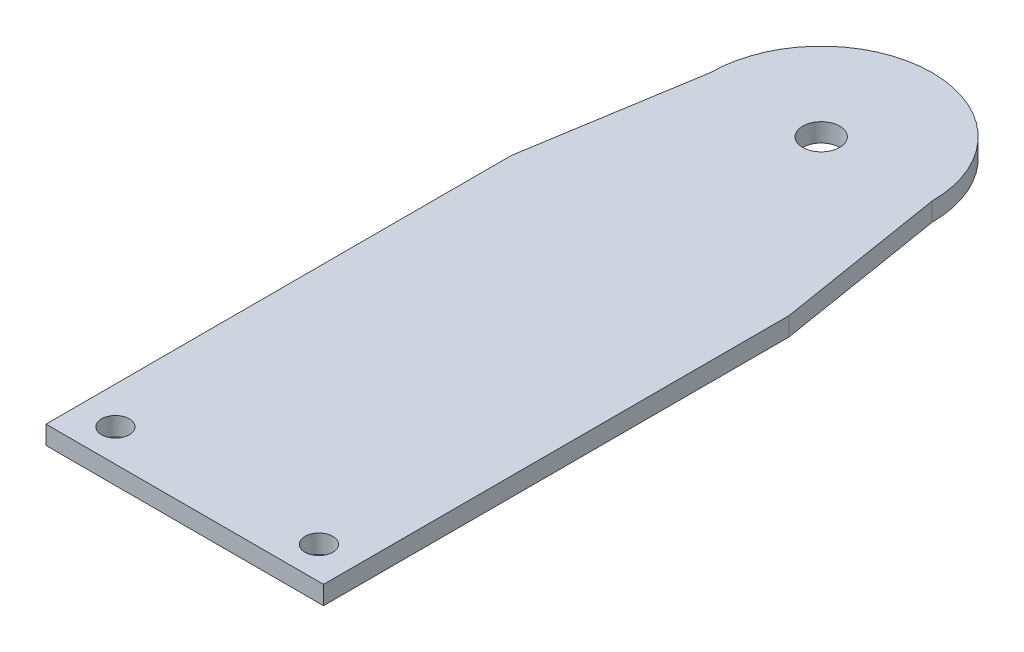
ISO-10303-21;
HEADER;
FILE_DESCRIPTION(('STEP AP214'),'2;1');
FILE_NAME('part.step','',(''),(''),'','','');
FILE_SCHEMA(('AUTOMOTIVE_DESIGN { 1 0 10303 214 1 1 1 1 }'));
ENDSEC;
DATA;
#1=APPLICATION_CONTEXT('core data for automotive mechanical design processes');
#2=APPLICATION_PROTOCOL_DEFINITION('international standard','automotive_design',2000,#1);
#3=PRODUCT_CONTEXT('',#1,'mechanical');
#4=PRODUCT('Part','Part','',(#3));
#5=PRODUCT_RELATED_PRODUCT_CATEGORY('part','',(#4));
#6=PRODUCT_DEFINITION_FORMATION('','',#4);
#7=PRODUCT_DEFINITION_CONTEXT('part definition',#1,'design');
#8=PRODUCT_DEFINITION('design','',#6,#7);
#9=PRODUCT_DEFINITION_SHAPE('','',#8);
#10=(LENGTH_UNIT() NAMED_UNIT(*) SI_UNIT(.MILLI.,.METRE.));
#11=(NAMED_UNIT(*) PLANE_ANGLE_UNIT() SI_UNIT($,.RADIAN.));
#12=(NAMED_UNIT(*) SI_UNIT($,.STERADIAN.) SOLID_ANGLE_UNIT());
#13=UNCERTAINTY_MEASURE_WITH_UNIT(LENGTH_MEASURE(1.E-05),#10,'distance_accuracy_value','');
#14=(GEOMETRIC_REPRESENTATION_CONTEXT(3) GLOBAL_UNCERTAINTY_ASSIGNED_CONTEXT((#13)) GLOBAL_UNIT_ASSIGNED_CONTEXT((#10,
#11,#12)) REPRESENTATION_CONTEXT('',''));
#15=CARTESIAN_POINT('',(0.,0.,0.));
#16=DIRECTION('',(0.,0.,1.));
#17=DIRECTION('',(1.,0.,0.));
#18=AXIS2_PLACEMENT_3D('',#15,#16,#17);
#19=CARTESIAN_POINT('',(-2.62522791540278,2.,-39.1827211912994));
#20=DIRECTION('',(0.,1.,0.));
#21=DIRECTION('',(0.,0.,1.));
#22=AXIS2_PLACEMENT_3D('',#19,#20,#21);
#23=PLANE('',#22);
#24=CARTESIAN_POINT('',(8.37477208459722,2.,26.1172788087006));
#25=DIRECTION('',(0.,1.,0.));
#26=DIRECTION('',(0.,0.,1.));
#27=AXIS2_PLACEMENT_3D('',#24,#25,#26);
#28=CIRCLE('',#27,1.5);
#29=CARTESIAN_POINT('',(8.37477208459722,2.,27.6172788087006));
#30=VERTEX_POINT('',#29);
#31=EDGE_CURVE('E186',#30,#30,#28,.T.);
#32=ORIENTED_EDGE('',*,*,#31,.F.);
#33=EDGE_LOOP('',(#32));
#34=FACE_BOUND('',#33,.T.);
#35=DIRECTION('',(0.,0.,1.));
#36=VECTOR('',#35,1.);
#37=CARTESIAN_POINT('',(-17.6252279154028,2.,29.6172788087006));
#38=LINE('',#37,#36);
#39=CARTESIAN_POINT('',(-17.6252279154028,2.,-20.6827211912994));
#40=VERTEX_POINT('',#39);
#41=CARTESIAN_POINT('',(-17.6252279154028,2.,29.6172788087006));
#42=VERTEX_POINT('',#41);
#43=EDGE_CURVE('E131',#40,#42,#38,.T.);
#44=ORIENTED_EDGE('',*,*,#43,.T.);
#45=DIRECTION('',(1.,0.,0.));
#46=VECTOR('',#45,1.);
#47=CARTESIAN_POINT('',(-10.6252279154028,2.,29.6172788087006));
#48=LINE('',#47,#46);
#49=CARTESIAN_POINT('',(12.3747720845972,2.,29.6172788087006));
#50=VERTEX_POINT('',#49);
#51=EDGE_CURVE('E89',#42,#50,#48,.T.);
#52=ORIENTED_EDGE('',*,*,#51,.T.);
#53=DIRECTION('',(0.,0.,-1.));
#54=VECTOR('',#53,1.);
#55=CARTESIAN_POINT('',(12.3747720845972,2.,29.6172788087006));
#56=LINE('',#55,#54);
#57=CARTESIAN_POINT('',(12.3747720845972,2.,-20.6827211912994));
#58=VERTEX_POINT('',#57);
#59=EDGE_CURVE('E102',#50,#58,#56,.T.);
#60=ORIENTED_EDGE('',*,*,#59,.T.);
#61=DIRECTION('',(-0.160071158553662,0.,-0.987105477747585));
#62=VECTOR('',#61,1.);
#63=CARTESIAN_POINT('',(12.3747720845972,2.,-20.6827211912994));
#64=LINE('',#63,#62);
#65=CARTESIAN_POINT('',(9.37477208459723,2.,-39.1827211912994));
#66=VERTEX_POINT('',#65);
#67=EDGE_CURVE('E96',#58,#66,#64,.T.);
#68=ORIENTED_EDGE('',*,*,#67,.T.);
#69=CARTESIAN_POINT('',(-2.62522791540278,2.,-39.1827211912994));
#70=DIRECTION('',(0.,1.,0.));
#71=DIRECTION('',(0.,0.,1.));
#72=AXIS2_PLACEMENT_3D('',#69,#70,#71);
#73=CIRCLE('',#72,12.);
#74=CARTESIAN_POINT('',(-14.6252279154028,2.,-39.1827211912994));
#75=VERTEX_POINT('',#74);
#76=EDGE_CURVE('E100',#66,#75,#73,.T.);
#77=ORIENTED_EDGE('',*,*,#76,.T.);
#78=DIRECTION('',(-0.160071158553662,0.,0.987105477747585));
#79=VECTOR('',#78,1.);
#80=CARTESIAN_POINT('',(-17.6252279154028,2.,-20.6827211912994));
#81=LINE('',#80,#79);
#82=EDGE_CURVE('E52',#75,#40,#81,.T.);
#83=ORIENTED_EDGE('',*,*,#82,.T.);
#84=EDGE_LOOP('',(#44,#52,#60,#68,#77,#83));
#85=FACE_BOUND('',#84,.T.);
#86=CARTESIAN_POINT('',(-13.6252279154028,2.,26.1172788087006));
#87=DIRECTION('',(0.,1.,0.));
#88=DIRECTION('',(0.,0.,1.));
#89=AXIS2_PLACEMENT_3D('',#86,#87,#88);
#90=CIRCLE('',#89,1.5);
#91=CARTESIAN_POINT('',(-13.6252279154028,2.,27.6172788087006));
#92=VERTEX_POINT('',#91);
#93=EDGE_CURVE('E124',#92,#92,#90,.T.);
#94=ORIENTED_EDGE('',*,*,#93,.F.);
#95=EDGE_LOOP('',(#94));
#96=FACE_BOUND('',#95,.T.);
#97=CARTESIAN_POINT('',(-2.62522791540278,2.,-39.1827211912994));
#98=DIRECTION('',(0.,1.,0.));
#99=DIRECTION('',(0.,0.,1.));
#100=AXIS2_PLACEMENT_3D('',#97,#98,#99);
#101=CIRCLE('',#100,2.);
#102=CARTESIAN_POINT('',(-2.62522791540278,2.,-37.1827211912994));
#103=VERTEX_POINT('',#102);
#104=EDGE_CURVE('E177',#103,#103,#101,.T.);
#105=ORIENTED_EDGE('',*,*,#104,.F.);
#106=EDGE_LOOP('',(#105));
#107=FACE_BOUND('',#106,.T.);
#108=ADVANCED_FACE('F35',(#34,#85,#96,#107),#23,.T.);
#109=CARTESIAN_POINT('',(-2.62522791540278,0.,-39.1827211912994));
#110=DIRECTION('',(0.,1.,0.));
#111=DIRECTION('',(0.,0.,1.));
#112=AXIS2_PLACEMENT_3D('',#109,#110,#111);
#113=PLANE('',#112);
#114=DIRECTION('',(0.,0.,1.));
#115=VECTOR('',#114,1.);
#116=CARTESIAN_POINT('',(-17.6252279154028,0.,29.6172788087006));
#117=LINE('',#116,#115);
#118=CARTESIAN_POINT('',(-17.6252279154028,0.,-20.6827211912994));
#119=VERTEX_POINT('',#118);
#120=CARTESIAN_POINT('',(-17.6252279154028,0.,29.6172788087006));
#121=VERTEX_POINT('',#120);
#122=EDGE_CURVE('E120',#119,#121,#117,.T.);
#123=ORIENTED_EDGE('',*,*,#122,.F.);
#124=DIRECTION('',(-0.160071158553662,0.,0.987105477747585));
#125=VECTOR('',#124,1.);
#126=CARTESIAN_POINT('',(-17.6252279154028,0.,-20.6827211912994));
#127=LINE('',#126,#125);
#128=CARTESIAN_POINT('',(-14.6252279154028,0.,-39.1827211912994));
#129=VERTEX_POINT('',#128);
#130=EDGE_CURVE('E81',#129,#119,#127,.T.);
#131=ORIENTED_EDGE('',*,*,#130,.F.);
#132=CARTESIAN_POINT('',(-2.62522791540278,0.,-39.1827211912994));
#133=DIRECTION('',(0.,1.,0.));
#134=DIRECTION('',(0.,0.,1.));
#135=AXIS2_PLACEMENT_3D('',#132,#133,#134);
#136=CIRCLE('',#135,12.);
#137=CARTESIAN_POINT('',(9.37477208459723,0.,-39.1827211912994));
#138=VERTEX_POINT('',#137);
#139=EDGE_CURVE('E75',#138,#129,#136,.T.);
#140=ORIENTED_EDGE('',*,*,#139,.F.);
#141=DIRECTION('',(-0.160071158553662,0.,-0.987105477747585));
#142=VECTOR('',#141,1.);
#143=CARTESIAN_POINT('',(12.3747720845972,0.,-20.6827211912994));
#144=LINE('',#143,#142);
#145=CARTESIAN_POINT('',(12.3747720845972,0.,-20.6827211912994));
#146=VERTEX_POINT('',#145);
#147=EDGE_CURVE('E110',#146,#138,#144,.T.);
#148=ORIENTED_EDGE('',*,*,#147,.F.);
#149=DIRECTION('',(0.,0.,-1.));
#150=VECTOR('',#149,1.);
#151=CARTESIAN_POINT('',(12.3747720845972,0.,29.6172788087006));
#152=LINE('',#151,#150);
#153=CARTESIAN_POINT('',(12.3747720845972,0.,29.6172788087006));
#154=VERTEX_POINT('',#153);
#155=EDGE_CURVE('E126',#154,#146,#152,.T.);
#156=ORIENTED_EDGE('',*,*,#155,.F.);
#157=DIRECTION('',(1.,0.,0.));
#158=VECTOR('',#157,1.);
#159=CARTESIAN_POINT('',(5.37477208459723,0.,29.6172788087006));
#160=LINE('',#159,#158);
#161=EDGE_CURVE('E123',#121,#154,#160,.T.);
#162=ORIENTED_EDGE('',*,*,#161,.F.);
#163=EDGE_LOOP('',(#123,#131,#140,#148,#156,#162));
#164=FACE_BOUND('',#163,.T.);
#165=CARTESIAN_POINT('',(-13.6252279154028,0.,26.1172788087006));
#166=DIRECTION('',(0.,1.,0.));
#167=DIRECTION('',(0.,0.,1.));
#168=AXIS2_PLACEMENT_3D('',#165,#166,#167);
#169=CIRCLE('',#168,1.5);
#170=CARTESIAN_POINT('',(-13.6252279154028,0.,27.6172788087006));
#171=VERTEX_POINT('',#170);
#172=EDGE_CURVE('E189',#171,#171,#169,.T.);
#173=ORIENTED_EDGE('',*,*,#172,.T.);
#174=EDGE_LOOP('',(#173));
#175=FACE_BOUND('',#174,.T.);
#176=CARTESIAN_POINT('',(8.37477208459722,0.,26.1172788087006));
#177=DIRECTION('',(0.,1.,0.));
#178=DIRECTION('',(0.,0.,1.));
#179=AXIS2_PLACEMENT_3D('',#176,#177,#178);
#180=CIRCLE('',#179,1.5);
#181=CARTESIAN_POINT('',(8.37477208459722,0.,27.6172788087006));
#182=VERTEX_POINT('',#181);
#183=EDGE_CURVE('E183',#182,#182,#180,.T.);
#184=ORIENTED_EDGE('',*,*,#183,.T.);
#185=EDGE_LOOP('',(#184));
#186=FACE_BOUND('',#185,.T.);
#187=CARTESIAN_POINT('',(-2.62522791540278,0.,-39.1827211912994));
#188=DIRECTION('',(0.,1.,0.));
#189=DIRECTION('',(0.,0.,1.));
#190=AXIS2_PLACEMENT_3D('',#187,#188,#189);
#191=CIRCLE('',#190,2.);
#192=CARTESIAN_POINT('',(-2.62522791540278,0.,-37.1827211912994));
#193=VERTEX_POINT('',#192);
#194=EDGE_CURVE('E180',#193,#193,#191,.T.);
#195=ORIENTED_EDGE('',*,*,#194,.T.);
#196=EDGE_LOOP('',(#195));
#197=FACE_BOUND('',#196,.T.);
#198=ADVANCED_FACE('F140',(#164,#175,#186,#197),#113,.F.);
#199=CARTESIAN_POINT('',(-17.6252279154028,2.,29.6172788087006));
#200=DIRECTION('',(1.,0.,0.));
#201=DIRECTION('',(0.,0.,-1.));
#202=AXIS2_PLACEMENT_3D('',#199,#200,#201);
#203=PLANE('',#202);
#204=ORIENTED_EDGE('',*,*,#122,.T.);
#205=DIRECTION('',(0.,-1.,0.));
#206=VECTOR('',#205,1.);
#207=CARTESIAN_POINT('',(-17.6252279154028,2.,29.6172788087006));
#208=LINE('',#207,#206);
#209=EDGE_CURVE('E11',#42,#121,#208,.T.);
#210=ORIENTED_EDGE('',*,*,#209,.F.);
#211=ORIENTED_EDGE('',*,*,#43,.F.);
#212=DIRECTION('',(0.,-1.,0.));
#213=VECTOR('',#212,1.);
#214=CARTESIAN_POINT('',(-17.6252279154028,2.,-20.6827211912994));
#215=LINE('',#214,#213);
#216=EDGE_CURVE('E116',#40,#119,#215,.T.);
#217=ORIENTED_EDGE('',*,*,#216,.T.);
#218=EDGE_LOOP('',(#204,#210,#211,#217));
#219=FACE_BOUND('',#218,.T.);
#220=ADVANCED_FACE('F37',(#219),#203,.F.);
#221=CARTESIAN_POINT('',(5.37477208459723,2.,29.6172788087006));
#222=DIRECTION('',(0.,0.,-1.));
#223=DIRECTION('',(-1.,0.,0.));
#224=AXIS2_PLACEMENT_3D('',#221,#222,#223);
#225=PLANE('',#224);
#226=ORIENTED_EDGE('',*,*,#161,.T.);
#227=DIRECTION('',(0.,-1.,0.));
#228=VECTOR('',#227,1.);
#229=CARTESIAN_POINT('',(12.3747720845972,2.,29.6172788087006));
#230=LINE('',#229,#228);
#231=EDGE_CURVE('E44',#50,#154,#230,.T.);
#232=ORIENTED_EDGE('',*,*,#231,.F.);
#233=ORIENTED_EDGE('',*,*,#51,.F.);
#234=ORIENTED_EDGE('',*,*,#209,.T.);
#235=EDGE_LOOP('',(#226,#232,#233,#234));
#236=FACE_BOUND('',#235,.T.);
#237=ADVANCED_FACE('F239',(#236),#225,.F.);
#238=CARTESIAN_POINT('',(12.3747720845972,2.,29.6172788087006));
#239=DIRECTION('',(-1.,0.,0.));
#240=DIRECTION('',(0.,0.,1.));
#241=AXIS2_PLACEMENT_3D('',#238,#239,#240);
#242=PLANE('',#241);
#243=ORIENTED_EDGE('',*,*,#155,.T.);
#244=DIRECTION('',(0.,-1.,0.));
#245=VECTOR('',#244,1.);
#246=CARTESIAN_POINT('',(12.3747720845972,2.,-20.6827211912994));
#247=LINE('',#246,#245);
#248=EDGE_CURVE('E111',#58,#146,#247,.T.);
#249=ORIENTED_EDGE('',*,*,#248,.F.);
#250=ORIENTED_EDGE('',*,*,#59,.F.);
#251=ORIENTED_EDGE('',*,*,#231,.T.);
#252=EDGE_LOOP('',(#243,#249,#250,#251));
#253=FACE_BOUND('',#252,.T.);
#254=ADVANCED_FACE('F137',(#253),#242,.F.);
#255=CARTESIAN_POINT('',(12.3747720845972,2.,-20.6827211912994));
#256=DIRECTION('',(-0.987105477747585,0.,0.160071158553662));
#257=DIRECTION('',(0.160071158553662,0.,0.987105477747585));
#258=AXIS2_PLACEMENT_3D('',#255,#256,#257);
#259=PLANE('',#258);
#260=ORIENTED_EDGE('',*,*,#147,.T.);
#261=DIRECTION('',(0.,-1.,0.));
#262=VECTOR('',#261,1.);
#263=CARTESIAN_POINT('',(9.37477208459723,2.,-39.1827211912994));
#264=LINE('',#263,#262);
#265=EDGE_CURVE('E107',#66,#138,#264,.T.);
#266=ORIENTED_EDGE('',*,*,#265,.F.);
#267=ORIENTED_EDGE('',*,*,#67,.F.);
#268=ORIENTED_EDGE('',*,*,#248,.T.);
#269=EDGE_LOOP('',(#260,#266,#267,#268));
#270=FACE_BOUND('',#269,.T.);
#271=ADVANCED_FACE('F108',(#270),#259,.F.);
#272=CARTESIAN_POINT('',(-2.62522791540278,2.,-39.1827211912994));
#273=DIRECTION('',(0.,-1.,0.));
#274=DIRECTION('',(0.,0.,-1.));
#275=AXIS2_PLACEMENT_3D('',#272,#273,#274);
#276=CYLINDRICAL_SURFACE('',#275,12.);
#277=ORIENTED_EDGE('',*,*,#139,.T.);
#278=DIRECTION('',(0.,-1.,0.));
#279=VECTOR('',#278,1.);
#280=CARTESIAN_POINT('',(-14.6252279154028,2.,-39.1827211912994));
#281=LINE('',#280,#279);
#282=EDGE_CURVE('E112',#75,#129,#281,.T.);
#283=ORIENTED_EDGE('',*,*,#282,.F.);
#284=ORIENTED_EDGE('',*,*,#76,.F.);
#285=ORIENTED_EDGE('',*,*,#265,.T.);
#286=EDGE_LOOP('',(#277,#283,#284,#285));
#287=FACE_BOUND('',#286,.T.);
#288=ADVANCED_FACE('F114',(#287),#276,.T.);
#289=CARTESIAN_POINT('',(-17.6252279154028,2.,-20.6827211912994));
#290=DIRECTION('',(0.987105477747585,0.,0.160071158553662));
#291=DIRECTION('',(0.160071158553662,0.,-0.987105477747585));
#292=AXIS2_PLACEMENT_3D('',#289,#290,#291);
#293=PLANE('',#292);
#294=ORIENTED_EDGE('',*,*,#130,.T.);
#295=ORIENTED_EDGE('',*,*,#216,.F.);
#296=ORIENTED_EDGE('',*,*,#82,.F.);
#297=ORIENTED_EDGE('',*,*,#282,.T.);
#298=EDGE_LOOP('',(#294,#295,#296,#297));
#299=FACE_BOUND('',#298,.T.);
#300=ADVANCED_FACE('F145',(#299),#293,.F.);
#301=CARTESIAN_POINT('',(-13.6252279154028,2.,26.1172788087006));
#302=DIRECTION('',(0.,-1.,0.));
#303=DIRECTION('',(0.,0.,-1.));
#304=AXIS2_PLACEMENT_3D('',#301,#302,#303);
#305=CYLINDRICAL_SURFACE('',#304,1.5);
#306=ORIENTED_EDGE('',*,*,#93,.T.);
#307=EDGE_LOOP('',(#306));
#308=FACE_BOUND('',#307,.T.);
#309=ORIENTED_EDGE('',*,*,#172,.F.);
#310=EDGE_LOOP('',(#309));
#311=FACE_BOUND('',#310,.T.);
#312=ADVANCED_FACE('F147',(#308,#311),#305,.F.);
#313=CARTESIAN_POINT('',(8.37477208459722,2.,26.1172788087006));
#314=DIRECTION('',(0.,-1.,0.));
#315=DIRECTION('',(0.,0.,-1.));
#316=AXIS2_PLACEMENT_3D('',#313,#314,#315);
#317=CYLINDRICAL_SURFACE('',#316,1.5);
#318=ORIENTED_EDGE('',*,*,#31,.T.);
#319=EDGE_LOOP('',(#318));
#320=FACE_BOUND('',#319,.T.);
#321=ORIENTED_EDGE('',*,*,#183,.F.);
#322=EDGE_LOOP('',(#321));
#323=FACE_BOUND('',#322,.T.);
#324=ADVANCED_FACE('F153',(#320,#323),#317,.F.);
#325=CARTESIAN_POINT('',(-2.62522791540278,2.,-39.1827211912994));
#326=DIRECTION('',(0.,-1.,0.));
#327=DIRECTION('',(0.,0.,-1.));
#328=AXIS2_PLACEMENT_3D('',#325,#326,#327);
#329=CYLINDRICAL_SURFACE('',#328,2.);
#330=ORIENTED_EDGE('',*,*,#104,.T.);
#331=EDGE_LOOP('',(#330));
#332=FACE_BOUND('',#331,.T.);
#333=ORIENTED_EDGE('',*,*,#194,.F.);
#334=EDGE_LOOP('',(#333));
#335=FACE_BOUND('',#334,.T.);
#336=ADVANCED_FACE('F168',(#332,#335),#329,.F.);
#337=CLOSED_SHELL('',(#108,#198,#220,#237,#254,#271,#288,#300,#312,#324,#336));
#338=MANIFOLD_SOLID_BREP('B2',#337);
#339=ADVANCED_BREP_SHAPE_REPRESENTATION('',(#18,#338),#14);
#340=SHAPE_DEFINITION_REPRESENTATION(#9,#339);
ENDSEC;
END-ISO-10303-21;
